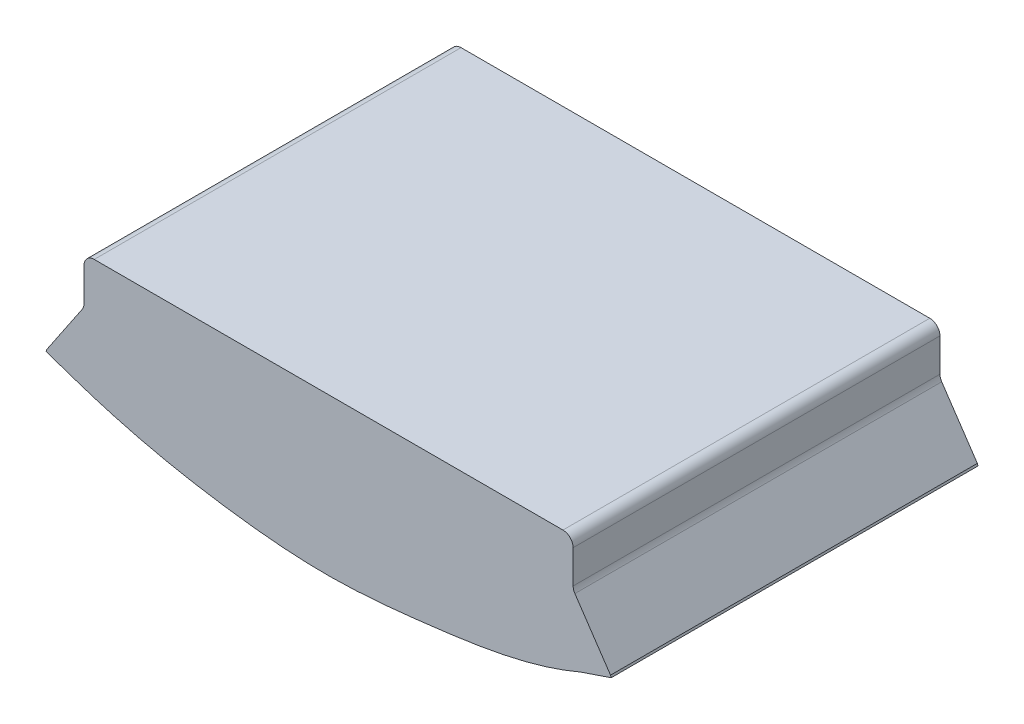
ISO-10303-21;
HEADER;
FILE_DESCRIPTION(('STEP AP214'),'2;1');
FILE_NAME('part.step','',(''),(''),'','','');
FILE_SCHEMA(('AUTOMOTIVE_DESIGN { 1 0 10303 214 1 1 1 1 }'));
ENDSEC;
DATA;
#1=APPLICATION_CONTEXT('core data for automotive mechanical design processes');
#2=APPLICATION_PROTOCOL_DEFINITION('international standard','automotive_design',2000,#1);
#3=PRODUCT_CONTEXT('',#1,'mechanical');
#4=PRODUCT('Part','Part','',(#3));
#5=PRODUCT_RELATED_PRODUCT_CATEGORY('part','',(#4));
#6=PRODUCT_DEFINITION_FORMATION('','',#4);
#7=PRODUCT_DEFINITION_CONTEXT('part definition',#1,'design');
#8=PRODUCT_DEFINITION('design','',#6,#7);
#9=PRODUCT_DEFINITION_SHAPE('','',#8);
#10=(LENGTH_UNIT() NAMED_UNIT(*) SI_UNIT(.MILLI.,.METRE.));
#11=(NAMED_UNIT(*) PLANE_ANGLE_UNIT() SI_UNIT($,.RADIAN.));
#12=(NAMED_UNIT(*) SI_UNIT($,.STERADIAN.) SOLID_ANGLE_UNIT());
#13=UNCERTAINTY_MEASURE_WITH_UNIT(LENGTH_MEASURE(1.E-05),#10,'distance_accuracy_value','');
#14=(GEOMETRIC_REPRESENTATION_CONTEXT(3) GLOBAL_UNCERTAINTY_ASSIGNED_CONTEXT((#13)) GLOBAL_UNIT_ASSIGNED_CONTEXT((#10,
#11,#12)) REPRESENTATION_CONTEXT('',''));
#15=CARTESIAN_POINT('',(0.,0.,0.));
#16=DIRECTION('',(0.,0.,1.));
#17=DIRECTION('',(1.,0.,0.));
#18=AXIS2_PLACEMENT_3D('',#15,#16,#17);
#19=CARTESIAN_POINT('',(10.60705865884,-6.775613929519,-46.7853296556947));
#20=CARTESIAN_POINT('',(11.81606395075,-7.184694860199,-46.7853296556947));
#21=CARTESIAN_POINT('',(13.62803468407,-7.692085524658,-46.7853296556947));
#22=CARTESIAN_POINT('',(16.1138911623,-8.202802822298,-46.7853296556947));
#23=CARTESIAN_POINT('',(18.18955108598,-8.532681308654,-46.7853296556947));
#24=CARTESIAN_POINT('',(20.51228740333,-8.802843470433,-46.7853296556947));
#25=CARTESIAN_POINT('',(22.52587314706,-8.895511296227,-46.7853296556947));
#26=CARTESIAN_POINT('',(24.15772768344,-8.851859587251,-46.7853296556947));
#27=CARTESIAN_POINT('',(25.35125841485,-8.774619538877,-46.7853296556947));
#28=CARTESIAN_POINT('',(26.61040596379,-8.655649989857,-46.7853296556947));
#29=CARTESIAN_POINT('',(28.0528875909,-8.489315057883,-46.7853296556947));
#30=CARTESIAN_POINT('',(29.71543642498,-8.277918045001,-46.7853296556947));
#31=CARTESIAN_POINT('',(32.22942182083,-7.855388775821,-46.7853296556947));
#32=CARTESIAN_POINT('',(34.11916474122,-7.321218717524,-46.7853296556947));
#33=CARTESIAN_POINT('',(35.3768920462,-6.781044394183,-46.7853296556947));
#34=(BOUNDED_CURVE() B_SPLINE_CURVE(3,(#19,#20,#21,#22,#23,#24,#25,#26,#27,#28,#29,#30,#31,#32,
#33),.UNSPECIFIED.,.F.,.F.) B_SPLINE_CURVE_WITH_KNOTS((4,1,1,1,1,1,1,1,1,1,1,1,4),(0.,
0.1463150903933,0.2223989373979,0.3048231049861,0.3983524240344,0.4996758530035,0.5445699261467,
0.5932051720519,0.641840417957,0.6945286010209,0.7647598444097,0.8408436914142,1.),
.UNSPECIFIED.) CURVE() GEOMETRIC_REPRESENTATION_ITEM() RATIONAL_B_SPLINE_CURVE((1.,1.,1.,1.,1.,
1.,1.,1.,1.,1.,1.,1.,1.,1.,1.)) REPRESENTATION_ITEM(''));
#35=DIRECTION('',(0.,0.,1.));
#36=VECTOR('',#35,1.);
#37=SURFACE_OF_LINEAR_EXTRUSION('',#34,#36);
#38=CARTESIAN_POINT('',(10.60705865884,-6.775613929519,-18.));
#39=CARTESIAN_POINT('',(11.81606395075,-7.184694860199,-18.));
#40=CARTESIAN_POINT('',(13.62803468407,-7.692085524658,-18.));
#41=CARTESIAN_POINT('',(16.1138911623,-8.202802822298,-18.));
#42=CARTESIAN_POINT('',(18.18955108598,-8.532681308654,-18.));
#43=CARTESIAN_POINT('',(20.51228740333,-8.802843470433,-18.));
#44=CARTESIAN_POINT('',(22.52587314706,-8.895511296227,-18.));
#45=CARTESIAN_POINT('',(24.15772768344,-8.851859587251,-18.));
#46=CARTESIAN_POINT('',(25.35125841485,-8.774619538877,-18.));
#47=CARTESIAN_POINT('',(26.61040596379,-8.655649989857,-18.));
#48=CARTESIAN_POINT('',(28.0528875909,-8.489315057883,-18.));
#49=CARTESIAN_POINT('',(29.71543642498,-8.277918045001,-18.));
#50=CARTESIAN_POINT('',(32.22942182083,-7.855388775821,-18.));
#51=CARTESIAN_POINT('',(34.11916474122,-7.321218717524,-18.));
#52=CARTESIAN_POINT('',(35.3768920462,-6.781044394183,-18.));
#53=(BOUNDED_CURVE() B_SPLINE_CURVE(3,(#38,#39,#40,#41,#42,#43,#44,#45,#46,#47,#48,#49,#50,#51,
#52),.UNSPECIFIED.,.F.,.F.) B_SPLINE_CURVE_WITH_KNOTS((4,1,1,1,1,1,1,1,1,1,1,1,4),(0.,
0.1463150903933,0.2223989373979,0.3048231049861,0.3983524240344,0.4996758530035,0.5445699261467,
0.5932051720519,0.641840417957,0.6945286010209,0.7647598444097,0.8408436914142,1.),
.UNSPECIFIED.) CURVE() GEOMETRIC_REPRESENTATION_ITEM() RATIONAL_B_SPLINE_CURVE((1.,1.,1.,1.,1.,
1.,1.,1.,1.,1.,1.,1.,1.,1.,1.)) REPRESENTATION_ITEM(''));
#54=CARTESIAN_POINT('',(35.3768920462,-6.781044394183,-18.));
#55=VERTEX_POINT('',#54);
#56=CARTESIAN_POINT('',(10.60705865884,-6.775613929519,-18.));
#57=VERTEX_POINT('',#56);
#58=EDGE_CURVE('E49',#55,#57,#53,.F.);
#59=ORIENTED_EDGE('',*,*,#58,.F.);
#60=DIRECTION('',(0.,0.,1.));
#61=VECTOR('',#60,1.);
#62=CARTESIAN_POINT('',(35.3768920462,-6.781044394183,-46.7853296556947));
#63=LINE('',#62,#61);
#64=CARTESIAN_POINT('',(35.3768920462,-6.781044394183,0.));
#65=VERTEX_POINT('',#64);
#66=EDGE_CURVE('E140',#55,#65,#63,.T.);
#67=ORIENTED_EDGE('',*,*,#66,.T.);
#68=CARTESIAN_POINT('',(35.3768920462,-6.781044394183,0.));
#69=CARTESIAN_POINT('',(34.11916474122,-7.321218717524,0.));
#70=CARTESIAN_POINT('',(32.22942182083,-7.855388775821,0.));
#71=CARTESIAN_POINT('',(29.71543642498,-8.277918045001,0.));
#72=CARTESIAN_POINT('',(28.0528875909,-8.489315057883,0.));
#73=CARTESIAN_POINT('',(26.61040596379,-8.655649989857,0.));
#74=CARTESIAN_POINT('',(25.35125841485,-8.774619538877,0.));
#75=CARTESIAN_POINT('',(24.15772768344,-8.851859587251,0.));
#76=CARTESIAN_POINT('',(22.52587314706,-8.895511296227,0.));
#77=CARTESIAN_POINT('',(20.51228740333,-8.802843470433,0.));
#78=CARTESIAN_POINT('',(18.18955108598,-8.532681308654,0.));
#79=CARTESIAN_POINT('',(16.1138911623,-8.202802822298,0.));
#80=CARTESIAN_POINT('',(13.62803468407,-7.692085524658,0.));
#81=CARTESIAN_POINT('',(11.81606395075,-7.184694860199,0.));
#82=CARTESIAN_POINT('',(10.60705865884,-6.775613929519,0.));
#83=(BOUNDED_CURVE() B_SPLINE_CURVE(3,(#68,#69,#70,#71,#72,#73,#74,#75,#76,#77,#78,#79,#80,#81,
#82),.UNSPECIFIED.,.F.,.F.) B_SPLINE_CURVE_WITH_KNOTS((4,1,1,1,1,1,1,1,1,1,1,1,4),(0.,
0.1591563085858,0.2352401555903,0.3054713989791,0.358159582043,0.4067948279481,0.4554300738533,
0.5003241469965,0.6016475759656,0.6951768950139,0.7776010626021,0.8536849096067,1.),
.UNSPECIFIED.) CURVE() GEOMETRIC_REPRESENTATION_ITEM() RATIONAL_B_SPLINE_CURVE((1.,1.,1.,1.,1.,
1.,1.,1.,1.,1.,1.,1.,1.,1.,1.)) REPRESENTATION_ITEM(''));
#84=CARTESIAN_POINT('',(10.60705865884,-6.775613929519,0.));
#85=VERTEX_POINT('',#84);
#86=EDGE_CURVE('E144',#85,#65,#83,.F.);
#87=ORIENTED_EDGE('',*,*,#86,.F.);
#88=DIRECTION('',(0.,0.,1.));
#89=VECTOR('',#88,1.);
#90=CARTESIAN_POINT('',(10.60705865884,-6.775613929519,-46.7853296556947));
#91=LINE('',#90,#89);
#92=EDGE_CURVE('E43',#57,#85,#91,.T.);
#93=ORIENTED_EDGE('',*,*,#92,.F.);
#94=EDGE_LOOP('',(#59,#67,#87,#93));
#95=FACE_BOUND('',#94,.T.);
#96=ADVANCED_FACE('F38',(#95),#37,.T.);
#97=CARTESIAN_POINT('',(9.133653328215,-6.277070186195,-46.7853296556947));
#98=DIRECTION('',(-0.320511212709663,-0.947244721562164,0.));
#99=DIRECTION('',(0.947244721562164,-0.320511212709663,0.));
#100=AXIS2_PLACEMENT_3D('',#97,#98,#99);
#101=PLANE('',#100);
#102=DIRECTION('',(-0.947244721562164,0.320511212709663,0.));
#103=VECTOR('',#102,1.);
#104=CARTESIAN_POINT('',(9.133653328215,-6.277070186195,-18.));
#105=LINE('',#104,#103);
#106=CARTESIAN_POINT('',(9.133653328215,-6.277070186195,-18.));
#107=VERTEX_POINT('',#106);
#108=EDGE_CURVE('E361',#57,#107,#105,.T.);
#109=ORIENTED_EDGE('',*,*,#108,.F.);
#110=ORIENTED_EDGE('',*,*,#92,.T.);
#111=DIRECTION('',(0.947244721562164,-0.320511212709663,0.));
#112=VECTOR('',#111,1.);
#113=CARTESIAN_POINT('',(9.133653328215,-6.277070186195,0.));
#114=LINE('',#113,#112);
#115=CARTESIAN_POINT('',(9.133653328215,-6.277070186195,0.));
#116=VERTEX_POINT('',#115);
#117=EDGE_CURVE('E150',#116,#85,#114,.T.);
#118=ORIENTED_EDGE('',*,*,#117,.F.);
#119=DIRECTION('',(0.,0.,1.));
#120=VECTOR('',#119,1.);
#121=CARTESIAN_POINT('',(9.133653328215,-6.277070186195,-46.7853296556947));
#122=LINE('',#121,#120);
#123=EDGE_CURVE('E365',#107,#116,#122,.T.);
#124=ORIENTED_EDGE('',*,*,#123,.F.);
#125=EDGE_LOOP('',(#109,#110,#118,#124));
#126=FACE_BOUND('',#125,.T.);
#127=ADVANCED_FACE('F182',(#126),#101,.T.);
#128=CARTESIAN_POINT('',(9.165704449486,-6.182345714039,-46.7853296556947));
#129=DIRECTION('',(-0.947244721561839,0.320511212710623,0.));
#130=DIRECTION('',(-0.320511212710623,-0.947244721561839,0.));
#131=AXIS2_PLACEMENT_3D('',#128,#129,#130);
#132=PLANE('',#131);
#133=DIRECTION('',(0.320511212710623,0.947244721561839,0.));
#134=VECTOR('',#133,1.);
#135=CARTESIAN_POINT('',(9.165704449486,-6.182345714039,-18.));
#136=LINE('',#135,#134);
#137=CARTESIAN_POINT('',(9.165704449486,-6.182345714039,-18.));
#138=VERTEX_POINT('',#137);
#139=EDGE_CURVE('E366',#107,#138,#136,.T.);
#140=ORIENTED_EDGE('',*,*,#139,.F.);
#141=ORIENTED_EDGE('',*,*,#123,.T.);
#142=DIRECTION('',(-0.320511212710623,-0.947244721561839,0.));
#143=VECTOR('',#142,1.);
#144=CARTESIAN_POINT('',(9.165704449486,-6.182345714039,0.));
#145=LINE('',#144,#143);
#146=CARTESIAN_POINT('',(9.165704449486,-6.182345714039,0.));
#147=VERTEX_POINT('',#146);
#148=EDGE_CURVE('E376',#147,#116,#145,.T.);
#149=ORIENTED_EDGE('',*,*,#148,.F.);
#150=DIRECTION('',(0.,0.,1.));
#151=VECTOR('',#150,1.);
#152=CARTESIAN_POINT('',(9.165704449486,-6.182345714039,-46.7853296556947));
#153=LINE('',#152,#151);
#154=EDGE_CURVE('E370',#138,#147,#153,.T.);
#155=ORIENTED_EDGE('',*,*,#154,.F.);
#156=EDGE_LOOP('',(#140,#141,#149,#155));
#157=FACE_BOUND('',#156,.T.);
#158=ADVANCED_FACE('F185',(#157),#132,.T.);
#159=CARTESIAN_POINT('',(9.165704449486,-6.182345714039,-46.7853296556947));
#160=DIRECTION('',(-0.829037572554714,0.559192903471233,0.));
#161=DIRECTION('',(-0.559192903471233,-0.829037572554714,0.));
#162=AXIS2_PLACEMENT_3D('',#159,#160,#161);
#163=PLANE('',#162);
#164=DIRECTION('',(0.559192903471233,0.829037572554714,0.));
#165=VECTOR('',#164,1.);
#166=CARTESIAN_POINT('',(9.165704449486,-6.182345714039,-18.));
#167=LINE('',#166,#165);
#168=CARTESIAN_POINT('',(10.914518786279,-3.58962183713533,-18.));
#169=VERTEX_POINT('',#168);
#170=EDGE_CURVE('E447',#138,#169,#167,.T.);
#171=ORIENTED_EDGE('',*,*,#170,.F.);
#172=ORIENTED_EDGE('',*,*,#154,.T.);
#173=DIRECTION('',(-0.559192903471233,-0.829037572554714,0.));
#174=VECTOR('',#173,1.);
#175=CARTESIAN_POINT('',(9.165704449486,-6.182345714039,0.));
#176=LINE('',#175,#174);
#177=CARTESIAN_POINT('',(10.914518786279,-3.58962183713533,0.));
#178=VERTEX_POINT('',#177);
#179=EDGE_CURVE('E429',#178,#147,#176,.T.);
#180=ORIENTED_EDGE('',*,*,#179,.F.);
#181=DIRECTION('',(0.,0.,1.));
#182=VECTOR('',#181,1.);
#183=CARTESIAN_POINT('',(10.914518786279,-3.58962183713533,-46.7853296556947));
#184=LINE('',#183,#182);
#185=EDGE_CURVE('E373',#169,#178,#184,.T.);
#186=ORIENTED_EDGE('',*,*,#185,.F.);
#187=EDGE_LOOP('',(#171,#172,#180,#186));
#188=FACE_BOUND('',#187,.T.);
#189=ADVANCED_FACE('F189',(#188),#163,.T.);
#190=CARTESIAN_POINT('',(10.5,-3.3100253854,-46.7853296556947));
#191=DIRECTION('',(0.,0.,1.));
#192=DIRECTION('',(1.,0.,0.));
#193=AXIS2_PLACEMENT_3D('',#190,#191,#192);
#194=CYLINDRICAL_SURFACE('',#193,0.500000000001202);
#195=CARTESIAN_POINT('',(10.5,-3.3100253854,-18.));
#196=DIRECTION('',(0.,0.,1.));
#197=DIRECTION('',(1.,0.,0.));
#198=AXIS2_PLACEMENT_3D('',#195,#196,#197);
#199=CIRCLE('',#198,0.500000000001202);
#200=CARTESIAN_POINT('',(11.,-3.3100253854,-18.));
#201=VERTEX_POINT('',#200);
#202=EDGE_CURVE('E449',#169,#201,#199,.T.);
#203=ORIENTED_EDGE('',*,*,#202,.F.);
#204=ORIENTED_EDGE('',*,*,#185,.T.);
#205=CARTESIAN_POINT('',(10.5,-3.3100253854,0.));
#206=DIRECTION('',(0.,0.,-1.));
#207=DIRECTION('',(1.,0.,0.));
#208=AXIS2_PLACEMENT_3D('',#205,#206,#207);
#209=CIRCLE('',#208,0.500000000001202);
#210=CARTESIAN_POINT('',(11.,-3.3100253854,0.));
#211=VERTEX_POINT('',#210);
#212=EDGE_CURVE('E427',#211,#178,#209,.T.);
#213=ORIENTED_EDGE('',*,*,#212,.F.);
#214=DIRECTION('',(0.,0.,1.));
#215=VECTOR('',#214,1.);
#216=CARTESIAN_POINT('',(11.,-3.3100253854,-46.7853296556947));
#217=LINE('',#216,#215);
#218=EDGE_CURVE('E380',#201,#211,#217,.T.);
#219=ORIENTED_EDGE('',*,*,#218,.F.);
#220=EDGE_LOOP('',(#203,#204,#213,#219));
#221=FACE_BOUND('',#220,.T.);
#222=ADVANCED_FACE('F193',(#221),#194,.F.);
#223=CARTESIAN_POINT('',(11.,-3.3100253854,-46.7853296556947));
#224=DIRECTION('',(-1.,0.,0.));
#225=DIRECTION('',(0.,0.,1.));
#226=AXIS2_PLACEMENT_3D('',#223,#224,#225);
#227=PLANE('',#226);
#228=DIRECTION('',(0.,1.,0.));
#229=VECTOR('',#228,1.);
#230=CARTESIAN_POINT('',(11.,-3.3100253854,-18.));
#231=LINE('',#230,#229);
#232=CARTESIAN_POINT('',(11.,-1.682345714039,-18.));
#233=VERTEX_POINT('',#232);
#234=EDGE_CURVE('E452',#201,#233,#231,.T.);
#235=ORIENTED_EDGE('',*,*,#234,.F.);
#236=ORIENTED_EDGE('',*,*,#218,.T.);
#237=DIRECTION('',(0.,-1.,0.));
#238=VECTOR('',#237,1.);
#239=CARTESIAN_POINT('',(11.,-3.3100253854,0.));
#240=LINE('',#239,#238);
#241=CARTESIAN_POINT('',(11.,-1.682345714039,0.));
#242=VERTEX_POINT('',#241);
#243=EDGE_CURVE('E424',#242,#211,#240,.T.);
#244=ORIENTED_EDGE('',*,*,#243,.F.);
#245=DIRECTION('',(0.,0.,1.));
#246=VECTOR('',#245,1.);
#247=CARTESIAN_POINT('',(11.,-1.682345714039,-46.7853296556947));
#248=LINE('',#247,#246);
#249=EDGE_CURVE('E382',#233,#242,#248,.T.);
#250=ORIENTED_EDGE('',*,*,#249,.F.);
#251=EDGE_LOOP('',(#235,#236,#244,#250));
#252=FACE_BOUND('',#251,.T.);
#253=ADVANCED_FACE('F197',(#252),#227,.T.);
#254=CARTESIAN_POINT('',(11.5,-1.682345714039,-46.7853296556947));
#255=DIRECTION('',(0.,0.,1.));
#256=DIRECTION('',(1.,0.,0.));
#257=AXIS2_PLACEMENT_3D('',#254,#255,#256);
#258=CYLINDRICAL_SURFACE('',#257,0.5);
#259=CARTESIAN_POINT('',(11.5,-1.682345714039,-18.));
#260=DIRECTION('',(0.,0.,1.));
#261=DIRECTION('',(1.,0.,0.));
#262=AXIS2_PLACEMENT_3D('',#259,#260,#261);
#263=CIRCLE('',#262,0.5);
#264=CARTESIAN_POINT('',(11.5,-1.182345714039,-18.));
#265=VERTEX_POINT('',#264);
#266=EDGE_CURVE('E461',#233,#265,#263,.F.);
#267=ORIENTED_EDGE('',*,*,#266,.F.);
#268=ORIENTED_EDGE('',*,*,#249,.T.);
#269=CARTESIAN_POINT('',(11.5,-1.682345714039,0.));
#270=DIRECTION('',(0.,0.,1.));
#271=DIRECTION('',(1.,0.,0.));
#272=AXIS2_PLACEMENT_3D('',#269,#270,#271);
#273=CIRCLE('',#272,0.5);
#274=CARTESIAN_POINT('',(11.5,-1.182345714039,0.));
#275=VERTEX_POINT('',#274);
#276=EDGE_CURVE('E421',#275,#242,#273,.T.);
#277=ORIENTED_EDGE('',*,*,#276,.F.);
#278=DIRECTION('',(0.,0.,1.));
#279=VECTOR('',#278,1.);
#280=CARTESIAN_POINT('',(11.5,-1.182345714039,-46.7853296556947));
#281=LINE('',#280,#279);
#282=EDGE_CURVE('E384',#265,#275,#281,.T.);
#283=ORIENTED_EDGE('',*,*,#282,.F.);
#284=EDGE_LOOP('',(#267,#268,#277,#283));
#285=FACE_BOUND('',#284,.T.);
#286=ADVANCED_FACE('F201',(#285),#258,.T.);
#287=CARTESIAN_POINT('',(11.5,-1.182345714039,-46.7853296556947));
#288=DIRECTION('',(0.,1.,0.));
#289=DIRECTION('',(0.,0.,1.));
#290=AXIS2_PLACEMENT_3D('',#287,#288,#289);
#291=PLANE('',#290);
#292=DIRECTION('',(1.,0.,0.));
#293=VECTOR('',#292,1.);
#294=CARTESIAN_POINT('',(11.5,-1.182345714039,-18.));
#295=LINE('',#294,#293);
#296=CARTESIAN_POINT('',(34.5,-1.182345714039,-18.));
#297=VERTEX_POINT('',#296);
#298=EDGE_CURVE('E463',#265,#297,#295,.T.);
#299=ORIENTED_EDGE('',*,*,#298,.F.);
#300=ORIENTED_EDGE('',*,*,#282,.T.);
#301=DIRECTION('',(-1.,0.,0.));
#302=VECTOR('',#301,1.);
#303=CARTESIAN_POINT('',(11.5,-1.182345714039,0.));
#304=LINE('',#303,#302);
#305=CARTESIAN_POINT('',(34.5,-1.182345714039,0.));
#306=VERTEX_POINT('',#305);
#307=EDGE_CURVE('E418',#306,#275,#304,.T.);
#308=ORIENTED_EDGE('',*,*,#307,.F.);
#309=DIRECTION('',(0.,0.,1.));
#310=VECTOR('',#309,1.);
#311=CARTESIAN_POINT('',(34.5,-1.182345714039,-46.7853296556947));
#312=LINE('',#311,#310);
#313=EDGE_CURVE('E386',#297,#306,#312,.T.);
#314=ORIENTED_EDGE('',*,*,#313,.F.);
#315=EDGE_LOOP('',(#299,#300,#308,#314));
#316=FACE_BOUND('',#315,.T.);
#317=ADVANCED_FACE('F205',(#316),#291,.T.);
#318=CARTESIAN_POINT('',(34.5,-1.682345714039,-46.7853296556947));
#319=DIRECTION('',(0.,0.,1.));
#320=DIRECTION('',(1.,0.,0.));
#321=AXIS2_PLACEMENT_3D('',#318,#319,#320);
#322=CYLINDRICAL_SURFACE('',#321,0.5);
#323=CARTESIAN_POINT('',(34.5,-1.682345714039,-18.));
#324=DIRECTION('',(0.,0.,1.));
#325=DIRECTION('',(1.,0.,0.));
#326=AXIS2_PLACEMENT_3D('',#323,#324,#325);
#327=CIRCLE('',#326,0.5);
#328=CARTESIAN_POINT('',(35.,-1.682345714039,-18.));
#329=VERTEX_POINT('',#328);
#330=EDGE_CURVE('E465',#297,#329,#327,.F.);
#331=ORIENTED_EDGE('',*,*,#330,.F.);
#332=ORIENTED_EDGE('',*,*,#313,.T.);
#333=CARTESIAN_POINT('',(34.5,-1.682345714039,0.));
#334=DIRECTION('',(0.,0.,1.));
#335=DIRECTION('',(1.,0.,0.));
#336=AXIS2_PLACEMENT_3D('',#333,#334,#335);
#337=CIRCLE('',#336,0.5);
#338=CARTESIAN_POINT('',(35.,-1.682345714039,0.));
#339=VERTEX_POINT('',#338);
#340=EDGE_CURVE('E415',#339,#306,#337,.T.);
#341=ORIENTED_EDGE('',*,*,#340,.F.);
#342=DIRECTION('',(0.,0.,1.));
#343=VECTOR('',#342,1.);
#344=CARTESIAN_POINT('',(35.,-1.682345714039,-46.7853296556947));
#345=LINE('',#344,#343);
#346=EDGE_CURVE('E388',#329,#339,#345,.T.);
#347=ORIENTED_EDGE('',*,*,#346,.F.);
#348=EDGE_LOOP('',(#331,#332,#341,#347));
#349=FACE_BOUND('',#348,.T.);
#350=ADVANCED_FACE('F209',(#349),#322,.T.);
#351=CARTESIAN_POINT('',(35.,-1.682345714039,-46.7853296556947));
#352=DIRECTION('',(1.,0.,0.));
#353=DIRECTION('',(0.,0.,-1.));
#354=AXIS2_PLACEMENT_3D('',#351,#352,#353);
#355=PLANE('',#354);
#356=DIRECTION('',(0.,-1.,0.));
#357=VECTOR('',#356,1.);
#358=CARTESIAN_POINT('',(35.,-1.682345714039,-18.));
#359=LINE('',#358,#357);
#360=CARTESIAN_POINT('',(34.9999999999988,-3.3100253854,-18.));
#361=VERTEX_POINT('',#360);
#362=EDGE_CURVE('E467',#329,#361,#359,.T.);
#363=ORIENTED_EDGE('',*,*,#362,.F.);
#364=ORIENTED_EDGE('',*,*,#346,.T.);
#365=DIRECTION('',(0.,1.,0.));
#366=VECTOR('',#365,1.);
#367=CARTESIAN_POINT('',(35.,-1.682345714039,0.));
#368=LINE('',#367,#366);
#369=CARTESIAN_POINT('',(34.9999999999988,-3.3100253854,0.));
#370=VERTEX_POINT('',#369);
#371=EDGE_CURVE('E412',#370,#339,#368,.T.);
#372=ORIENTED_EDGE('',*,*,#371,.F.);
#373=DIRECTION('',(0.,0.,1.));
#374=VECTOR('',#373,1.);
#375=CARTESIAN_POINT('',(34.9999999999988,-3.3100253854,-46.7853296556947));
#376=LINE('',#375,#374);
#377=EDGE_CURVE('E390',#361,#370,#376,.T.);
#378=ORIENTED_EDGE('',*,*,#377,.F.);
#379=EDGE_LOOP('',(#363,#364,#372,#378));
#380=FACE_BOUND('',#379,.T.);
#381=ADVANCED_FACE('F213',(#380),#355,.T.);
#382=CARTESIAN_POINT('',(35.5,-3.3100253854,-46.7853296556947));
#383=DIRECTION('',(0.,0.,1.));
#384=DIRECTION('',(1.,0.,0.));
#385=AXIS2_PLACEMENT_3D('',#382,#383,#384);
#386=CYLINDRICAL_SURFACE('',#385,0.5000000000012);
#387=CARTESIAN_POINT('',(35.5,-3.3100253854,-18.));
#388=DIRECTION('',(0.,0.,1.));
#389=DIRECTION('',(1.,0.,0.));
#390=AXIS2_PLACEMENT_3D('',#387,#388,#389);
#391=CIRCLE('',#390,0.5000000000012);
#392=CARTESIAN_POINT('',(35.08548121372,-3.589621837136,-18.));
#393=VERTEX_POINT('',#392);
#394=EDGE_CURVE('E61',#361,#393,#391,.T.);
#395=ORIENTED_EDGE('',*,*,#394,.F.);
#396=ORIENTED_EDGE('',*,*,#377,.T.);
#397=CARTESIAN_POINT('',(35.5,-3.3100253854,0.));
#398=DIRECTION('',(0.,0.,-1.));
#399=DIRECTION('',(1.,0.,0.));
#400=AXIS2_PLACEMENT_3D('',#397,#398,#399);
#401=CIRCLE('',#400,0.5000000000012);
#402=CARTESIAN_POINT('',(35.08548121372,-3.589621837136,0.));
#403=VERTEX_POINT('',#402);
#404=EDGE_CURVE('E404',#403,#370,#401,.T.);
#405=ORIENTED_EDGE('',*,*,#404,.F.);
#406=DIRECTION('',(0.,0.,1.));
#407=VECTOR('',#406,1.);
#408=CARTESIAN_POINT('',(35.08548121372,-3.589621837136,-46.7853296556947));
#409=LINE('',#408,#407);
#410=EDGE_CURVE('E392',#393,#403,#409,.T.);
#411=ORIENTED_EDGE('',*,*,#410,.F.);
#412=EDGE_LOOP('',(#395,#396,#405,#411));
#413=FACE_BOUND('',#412,.T.);
#414=ADVANCED_FACE('F217',(#413),#386,.F.);
#415=CARTESIAN_POINT('',(35.08548121372,-3.589621837136,-46.7853296556947));
#416=DIRECTION('',(0.829037572555306,0.559192903470355,0.));
#417=DIRECTION('',(-0.559192903470355,0.829037572555306,0.));
#418=AXIS2_PLACEMENT_3D('',#415,#416,#417);
#419=PLANE('',#418);
#420=DIRECTION('',(0.559192903470355,-0.829037572555306,0.));
#421=VECTOR('',#420,1.);
#422=CARTESIAN_POINT('',(35.08548121372,-3.589621837136,-18.));
#423=LINE('',#422,#421);
#424=CARTESIAN_POINT('',(36.83429555051,-6.182345714039,-18.));
#425=VERTEX_POINT('',#424);
#426=EDGE_CURVE('E56',#393,#425,#423,.T.);
#427=ORIENTED_EDGE('',*,*,#426,.F.);
#428=ORIENTED_EDGE('',*,*,#410,.T.);
#429=DIRECTION('',(-0.559192903470355,0.829037572555306,0.));
#430=VECTOR('',#429,1.);
#431=CARTESIAN_POINT('',(35.08548121372,-3.589621837136,0.));
#432=LINE('',#431,#430);
#433=CARTESIAN_POINT('',(36.83429555051,-6.182345714039,0.));
#434=VERTEX_POINT('',#433);
#435=EDGE_CURVE('E400',#434,#403,#432,.T.);
#436=ORIENTED_EDGE('',*,*,#435,.F.);
#437=DIRECTION('',(0.,0.,1.));
#438=VECTOR('',#437,1.);
#439=CARTESIAN_POINT('',(36.83429555051,-6.182345714039,-46.7853296556947));
#440=LINE('',#439,#438);
#441=EDGE_CURVE('E394',#425,#434,#440,.T.);
#442=ORIENTED_EDGE('',*,*,#441,.F.);
#443=EDGE_LOOP('',(#427,#428,#436,#442));
#444=FACE_BOUND('',#443,.T.);
#445=ADVANCED_FACE('F221',(#444),#419,.T.);
#446=CARTESIAN_POINT('',(36.83429555051,-6.182345714039,-46.7853296556947));
#447=DIRECTION('',(0.947244721534521,0.32051121279136,0.));
#448=DIRECTION('',(-0.32051121279136,0.947244721534521,0.));
#449=AXIS2_PLACEMENT_3D('',#446,#447,#448);
#450=PLANE('',#449);
#451=DIRECTION('',(0.32051121279136,-0.947244721534521,0.));
#452=VECTOR('',#451,1.);
#453=CARTESIAN_POINT('',(36.83429555051,-6.182345714039,-18.));
#454=LINE('',#453,#452);
#455=CARTESIAN_POINT('',(36.86634667179,-6.277070186195,-18.));
#456=VERTEX_POINT('',#455);
#457=EDGE_CURVE('E368',#425,#456,#454,.T.);
#458=ORIENTED_EDGE('',*,*,#457,.F.);
#459=ORIENTED_EDGE('',*,*,#441,.T.);
#460=DIRECTION('',(-0.32051121279136,0.947244721534521,0.));
#461=VECTOR('',#460,1.);
#462=CARTESIAN_POINT('',(36.83429555051,-6.182345714039,0.));
#463=LINE('',#462,#461);
#464=CARTESIAN_POINT('',(36.86634667179,-6.277070186195,0.));
#465=VERTEX_POINT('',#464);
#466=EDGE_CURVE('E159',#465,#434,#463,.T.);
#467=ORIENTED_EDGE('',*,*,#466,.F.);
#468=DIRECTION('',(0.,0.,1.));
#469=VECTOR('',#468,1.);
#470=CARTESIAN_POINT('',(36.86634667179,-6.277070186195,-46.7853296556947));
#471=LINE('',#470,#469);
#472=EDGE_CURVE('E149',#456,#465,#471,.T.);
#473=ORIENTED_EDGE('',*,*,#472,.F.);
#474=EDGE_LOOP('',(#458,#459,#467,#473));
#475=FACE_BOUND('',#474,.T.);
#476=ADVANCED_FACE('F225',(#475),#450,.T.);
#477=CARTESIAN_POINT('',(35.3768920462,-6.781044394183,-46.7853296556947));
#478=DIRECTION('',(0.320511212707397,-0.94724472156293,0.));
#479=DIRECTION('',(0.947244721562931,0.320511212707397,0.));
#480=AXIS2_PLACEMENT_3D('',#477,#478,#479);
#481=PLANE('',#480);
#482=DIRECTION('',(-0.947244721562931,-0.320511212707397,0.));
#483=VECTOR('',#482,1.);
#484=CARTESIAN_POINT('',(35.3768920462,-6.781044394183,-18.));
#485=LINE('',#484,#483);
#486=EDGE_CURVE('E11',#456,#55,#485,.T.);
#487=ORIENTED_EDGE('',*,*,#486,.F.);
#488=ORIENTED_EDGE('',*,*,#472,.T.);
#489=DIRECTION('',(0.947244721562931,0.320511212707397,0.));
#490=VECTOR('',#489,1.);
#491=CARTESIAN_POINT('',(35.3768920462,-6.781044394183,0.));
#492=LINE('',#491,#490);
#493=EDGE_CURVE('E153',#65,#465,#492,.T.);
#494=ORIENTED_EDGE('',*,*,#493,.F.);
#495=ORIENTED_EDGE('',*,*,#66,.F.);
#496=EDGE_LOOP('',(#487,#488,#494,#495));
#497=FACE_BOUND('',#496,.T.);
#498=ADVANCED_FACE('F154',(#497),#481,.T.);
#499=CARTESIAN_POINT('',(23.0062786366506,-8.87441703321593,0.));
#500=DIRECTION('',(0.,0.,-1.));
#501=DIRECTION('',(-1.,0.,0.));
#502=AXIS2_PLACEMENT_3D('',#499,#500,#501);
#503=PLANE('',#502);
#504=ORIENTED_EDGE('',*,*,#86,.T.);
#505=ORIENTED_EDGE('',*,*,#493,.T.);
#506=ORIENTED_EDGE('',*,*,#466,.T.);
#507=ORIENTED_EDGE('',*,*,#435,.T.);
#508=ORIENTED_EDGE('',*,*,#404,.T.);
#509=ORIENTED_EDGE('',*,*,#371,.T.);
#510=ORIENTED_EDGE('',*,*,#340,.T.);
#511=ORIENTED_EDGE('',*,*,#307,.T.);
#512=ORIENTED_EDGE('',*,*,#276,.T.);
#513=ORIENTED_EDGE('',*,*,#243,.T.);
#514=ORIENTED_EDGE('',*,*,#212,.T.);
#515=ORIENTED_EDGE('',*,*,#179,.T.);
#516=ORIENTED_EDGE('',*,*,#148,.T.);
#517=ORIENTED_EDGE('',*,*,#117,.T.);
#518=EDGE_LOOP('',(#504,#505,#506,#507,#508,#509,#510,#511,#512,#513,#514,#515,#516,#517));
#519=FACE_BOUND('',#518,.T.);
#520=ADVANCED_FACE('F162',(#519),#503,.F.);
#521=CARTESIAN_POINT('',(0.,0.,-18.));
#522=DIRECTION('',(0.,0.,1.));
#523=DIRECTION('',(1.,0.,0.));
#524=AXIS2_PLACEMENT_3D('',#521,#522,#523);
#525=PLANE('',#524);
#526=ORIENTED_EDGE('',*,*,#58,.T.);
#527=ORIENTED_EDGE('',*,*,#108,.T.);
#528=ORIENTED_EDGE('',*,*,#139,.T.);
#529=ORIENTED_EDGE('',*,*,#170,.T.);
#530=ORIENTED_EDGE('',*,*,#202,.T.);
#531=ORIENTED_EDGE('',*,*,#234,.T.);
#532=ORIENTED_EDGE('',*,*,#266,.T.);
#533=ORIENTED_EDGE('',*,*,#298,.T.);
#534=ORIENTED_EDGE('',*,*,#330,.T.);
#535=ORIENTED_EDGE('',*,*,#362,.T.);
#536=ORIENTED_EDGE('',*,*,#394,.T.);
#537=ORIENTED_EDGE('',*,*,#426,.T.);
#538=ORIENTED_EDGE('',*,*,#457,.T.);
#539=ORIENTED_EDGE('',*,*,#486,.T.);
#540=EDGE_LOOP('',(#526,#527,#528,#529,#530,#531,#532,#533,#534,#535,#536,#537,#538,#539));
#541=FACE_BOUND('',#540,.T.);
#542=ADVANCED_FACE('F181',(#541),#525,.F.);
#543=CLOSED_SHELL('',(#96,#127,#158,#189,#222,#253,#286,#317,#350,#381,#414,#445,#476,#498,#520,#542));
#544=MANIFOLD_SOLID_BREP('B2',#543);
#545=ADVANCED_BREP_SHAPE_REPRESENTATION('',(#18,#544),#14);
#546=SHAPE_DEFINITION_REPRESENTATION(#9,#545);
ENDSEC;
END-ISO-10303-21;
